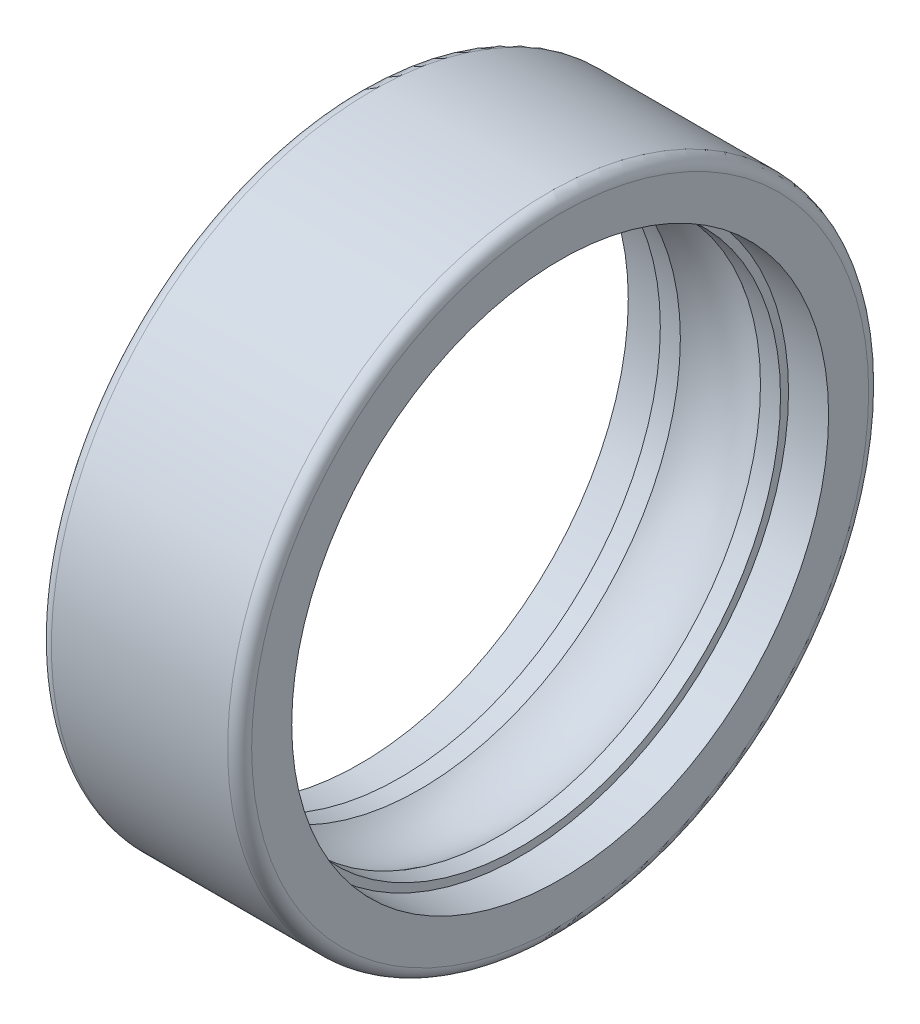
ISO-10303-21;
HEADER;
FILE_DESCRIPTION(('STEP AP214'),'2;1');
FILE_NAME('part.step','',(''),(''),'','','');
FILE_SCHEMA(('AUTOMOTIVE_DESIGN { 1 0 10303 214 1 1 1 1 }'));
ENDSEC;
DATA;
#1=APPLICATION_CONTEXT('core data for automotive mechanical design processes');
#2=APPLICATION_PROTOCOL_DEFINITION('international standard','automotive_design',2000,#1);
#3=PRODUCT_CONTEXT('',#1,'mechanical');
#4=PRODUCT('Part','Part','',(#3));
#5=PRODUCT_RELATED_PRODUCT_CATEGORY('part','',(#4));
#6=PRODUCT_DEFINITION_FORMATION('','',#4);
#7=PRODUCT_DEFINITION_CONTEXT('part definition',#1,'design');
#8=PRODUCT_DEFINITION('design','',#6,#7);
#9=PRODUCT_DEFINITION_SHAPE('','',#8);
#10=(LENGTH_UNIT() NAMED_UNIT(*) SI_UNIT(.MILLI.,.METRE.));
#11=(NAMED_UNIT(*) PLANE_ANGLE_UNIT() SI_UNIT($,.RADIAN.));
#12=(NAMED_UNIT(*) SI_UNIT($,.STERADIAN.) SOLID_ANGLE_UNIT());
#13=UNCERTAINTY_MEASURE_WITH_UNIT(LENGTH_MEASURE(1.E-05),#10,'distance_accuracy_value','');
#14=(GEOMETRIC_REPRESENTATION_CONTEXT(3) GLOBAL_UNCERTAINTY_ASSIGNED_CONTEXT((#13)) GLOBAL_UNIT_ASSIGNED_CONTEXT((#10,
#11,#12)) REPRESENTATION_CONTEXT('',''));
#15=CARTESIAN_POINT('',(0.,0.,0.));
#16=DIRECTION('',(0.,0.,1.));
#17=DIRECTION('',(1.,0.,0.));
#18=AXIS2_PLACEMENT_3D('',#15,#16,#17);
#19=CARTESIAN_POINT('',(-2.5,0.,6.7));
#20=DIRECTION('',(-1.,0.,0.));
#21=DIRECTION('',(0.,0.,1.));
#22=AXIS2_PLACEMENT_3D('',#19,#20,#21);
#23=PLANE('',#22);
#24=CARTESIAN_POINT('',(-2.5,0.,0.));
#25=DIRECTION('',(-1.,0.,0.));
#26=DIRECTION('',(0.,0.,1.));
#27=AXIS2_PLACEMENT_3D('',#24,#25,#26);
#28=CIRCLE('',#27,6.7);
#29=CARTESIAN_POINT('',(-2.5,0.,-6.7));
#30=VERTEX_POINT('',#29);
#31=EDGE_CURVE('E175',#30,#30,#28,.T.);
#32=ORIENTED_EDGE('',*,*,#31,.F.);
#33=EDGE_LOOP('',(#32));
#34=FACE_BOUND('',#33,.T.);
#35=CARTESIAN_POINT('',(-2.5,0.,0.));
#36=DIRECTION('',(-1.,0.,0.));
#37=DIRECTION('',(0.,0.,1.));
#38=AXIS2_PLACEMENT_3D('',#35,#36,#37);
#39=CIRCLE('',#38,7.7);
#40=CARTESIAN_POINT('',(-2.5,0.,-7.7));
#41=VERTEX_POINT('',#40);
#42=EDGE_CURVE('E24',#41,#41,#39,.T.);
#43=ORIENTED_EDGE('',*,*,#42,.T.);
#44=EDGE_LOOP('',(#43));
#45=FACE_BOUND('',#44,.T.);
#46=ADVANCED_FACE('F16',(#34,#45),#23,.T.);
#47=CARTESIAN_POINT('',(-2.2,0.,0.));
#48=DIRECTION('',(-1.,0.,0.));
#49=DIRECTION('',(0.,0.,1.));
#50=AXIS2_PLACEMENT_3D('',#47,#48,#49);
#51=TOROIDAL_SURFACE('',#50,7.7,0.3);
#52=ORIENTED_EDGE('',*,*,#42,.F.);
#53=CARTESIAN_POINT('',(-2.2,0.,-7.7));
#54=DIRECTION('',(0.,-1.,0.));
#55=DIRECTION('',(0.,0.,-1.));
#56=AXIS2_PLACEMENT_3D('',#53,#54,#55);
#57=CIRCLE('',#56,0.3);
#58=CARTESIAN_POINT('',(-2.2,0.,-8.));
#59=VERTEX_POINT('',#58);
#60=EDGE_CURVE('E11',#41,#59,#57,.T.);
#61=ORIENTED_EDGE('',*,*,#60,.T.);
#62=CARTESIAN_POINT('',(-2.2,0.,0.));
#63=DIRECTION('',(-1.,0.,0.));
#64=DIRECTION('',(0.,0.,1.));
#65=AXIS2_PLACEMENT_3D('',#62,#63,#64);
#66=CIRCLE('',#65,8.);
#67=EDGE_CURVE('E66',#59,#59,#66,.T.);
#68=ORIENTED_EDGE('',*,*,#67,.T.);
#69=ORIENTED_EDGE('',*,*,#60,.F.);
#70=EDGE_LOOP('',(#52,#61,#68,#69));
#71=FACE_BOUND('',#70,.T.);
#72=ADVANCED_FACE('F103',(#71),#51,.T.);
#73=CARTESIAN_POINT('',(0.,0.,0.));
#74=DIRECTION('',(-1.,0.,0.));
#75=DIRECTION('',(0.,0.,1.));
#76=AXIS2_PLACEMENT_3D('',#73,#74,#75);
#77=CYLINDRICAL_SURFACE('',#76,8.);
#78=ORIENTED_EDGE('',*,*,#67,.F.);
#79=DIRECTION('',(1.,0.,0.));
#80=VECTOR('',#79,1.);
#81=CARTESIAN_POINT('',(0.,0.,-8.));
#82=LINE('',#81,#80);
#83=CARTESIAN_POINT('',(2.2,0.,-8.));
#84=VERTEX_POINT('',#83);
#85=EDGE_CURVE('E73',#59,#84,#82,.T.);
#86=ORIENTED_EDGE('',*,*,#85,.T.);
#87=CARTESIAN_POINT('',(2.2,0.,0.));
#88=DIRECTION('',(-1.,0.,0.));
#89=DIRECTION('',(0.,0.,1.));
#90=AXIS2_PLACEMENT_3D('',#87,#88,#89);
#91=CIRCLE('',#90,8.);
#92=EDGE_CURVE('E64',#84,#84,#91,.T.);
#93=ORIENTED_EDGE('',*,*,#92,.T.);
#94=ORIENTED_EDGE('',*,*,#85,.F.);
#95=EDGE_LOOP('',(#78,#86,#93,#94));
#96=FACE_BOUND('',#95,.T.);
#97=ADVANCED_FACE('F105',(#96),#77,.T.);
#98=CARTESIAN_POINT('',(2.2,0.,0.));
#99=DIRECTION('',(-1.,0.,0.));
#100=DIRECTION('',(0.,0.,1.));
#101=AXIS2_PLACEMENT_3D('',#98,#99,#100);
#102=TOROIDAL_SURFACE('',#101,7.7,0.3);
#103=ORIENTED_EDGE('',*,*,#92,.F.);
#104=CARTESIAN_POINT('',(2.2,0.,-7.7));
#105=DIRECTION('',(0.,-1.,0.));
#106=DIRECTION('',(0.,0.,-1.));
#107=AXIS2_PLACEMENT_3D('',#104,#105,#106);
#108=CIRCLE('',#107,0.3);
#109=CARTESIAN_POINT('',(2.5,0.,-7.7));
#110=VERTEX_POINT('',#109);
#111=EDGE_CURVE('E59',#84,#110,#108,.T.);
#112=ORIENTED_EDGE('',*,*,#111,.T.);
#113=CARTESIAN_POINT('',(2.5,0.,0.));
#114=DIRECTION('',(-1.,0.,0.));
#115=DIRECTION('',(0.,0.,1.));
#116=AXIS2_PLACEMENT_3D('',#113,#114,#115);
#117=CIRCLE('',#116,7.7);
#118=EDGE_CURVE('E62',#110,#110,#117,.T.);
#119=ORIENTED_EDGE('',*,*,#118,.T.);
#120=ORIENTED_EDGE('',*,*,#111,.F.);
#121=EDGE_LOOP('',(#103,#112,#119,#120));
#122=FACE_BOUND('',#121,.T.);
#123=ADVANCED_FACE('F60',(#122),#102,.T.);
#124=CARTESIAN_POINT('',(2.5,0.,7.7));
#125=DIRECTION('',(1.,0.,0.));
#126=DIRECTION('',(0.,1.,0.));
#127=AXIS2_PLACEMENT_3D('',#124,#125,#126);
#128=PLANE('',#127);
#129=CARTESIAN_POINT('',(2.5,0.,0.));
#130=DIRECTION('',(-1.,0.,0.));
#131=DIRECTION('',(0.,0.,1.));
#132=AXIS2_PLACEMENT_3D('',#129,#130,#131);
#133=CIRCLE('',#132,6.7);
#134=CARTESIAN_POINT('',(2.5,0.,-6.7));
#135=VERTEX_POINT('',#134);
#136=EDGE_CURVE('E96',#135,#135,#133,.T.);
#137=ORIENTED_EDGE('',*,*,#136,.T.);
#138=EDGE_LOOP('',(#137));
#139=FACE_BOUND('',#138,.T.);
#140=ORIENTED_EDGE('',*,*,#118,.F.);
#141=EDGE_LOOP('',(#140));
#142=FACE_BOUND('',#141,.T.);
#143=ADVANCED_FACE('F116',(#139,#142),#128,.T.);
#144=CARTESIAN_POINT('',(2.,0.,0.));
#145=DIRECTION('',(-1.,0.,0.));
#146=DIRECTION('',(0.,0.,1.));
#147=AXIS2_PLACEMENT_3D('',#144,#145,#146);
#148=CYLINDRICAL_SURFACE('',#147,6.7);
#149=CARTESIAN_POINT('',(1.5,0.,0.));
#150=DIRECTION('',(-1.,0.,0.));
#151=DIRECTION('',(0.,0.,1.));
#152=AXIS2_PLACEMENT_3D('',#149,#150,#151);
#153=CIRCLE('',#152,6.7);
#154=CARTESIAN_POINT('',(1.5,0.,-6.7));
#155=VERTEX_POINT('',#154);
#156=EDGE_CURVE('E89',#155,#155,#153,.T.);
#157=ORIENTED_EDGE('',*,*,#156,.T.);
#158=DIRECTION('',(1.,0.,0.));
#159=VECTOR('',#158,1.);
#160=CARTESIAN_POINT('',(2.,0.,-6.7));
#161=LINE('',#160,#159);
#162=EDGE_CURVE('E93',#155,#135,#161,.T.);
#163=ORIENTED_EDGE('',*,*,#162,.T.);
#164=ORIENTED_EDGE('',*,*,#136,.F.);
#165=ORIENTED_EDGE('',*,*,#162,.F.);
#166=EDGE_LOOP('',(#157,#163,#164,#165));
#167=FACE_BOUND('',#166,.T.);
#168=ADVANCED_FACE('F119',(#167),#148,.F.);
#169=CARTESIAN_POINT('',(1.5,0.,6.7));
#170=DIRECTION('',(1.,0.,0.));
#171=DIRECTION('',(0.,1.,0.));
#172=AXIS2_PLACEMENT_3D('',#169,#170,#171);
#173=PLANE('',#172);
#174=CARTESIAN_POINT('',(1.5,0.,0.));
#175=DIRECTION('',(-1.,0.,0.));
#176=DIRECTION('',(0.,0.,1.));
#177=AXIS2_PLACEMENT_3D('',#174,#175,#176);
#178=CIRCLE('',#177,6.5);
#179=CARTESIAN_POINT('',(1.5,0.,-6.5));
#180=VERTEX_POINT('',#179);
#181=EDGE_CURVE('E88',#180,#180,#178,.T.);
#182=ORIENTED_EDGE('',*,*,#181,.T.);
#183=EDGE_LOOP('',(#182));
#184=FACE_BOUND('',#183,.T.);
#185=ORIENTED_EDGE('',*,*,#156,.F.);
#186=EDGE_LOOP('',(#185));
#187=FACE_BOUND('',#186,.T.);
#188=ADVANCED_FACE('F123',(#184,#187),#173,.T.);
#189=CARTESIAN_POINT('',(1.25,0.,0.));
#190=DIRECTION('',(-1.,0.,0.));
#191=DIRECTION('',(0.,0.,1.));
#192=AXIS2_PLACEMENT_3D('',#189,#190,#191);
#193=CYLINDRICAL_SURFACE('',#192,6.5);
#194=CARTESIAN_POINT('',(1.,0.,0.));
#195=DIRECTION('',(-1.,0.,0.));
#196=DIRECTION('',(0.,0.,1.));
#197=AXIS2_PLACEMENT_3D('',#194,#195,#196);
#198=CIRCLE('',#197,6.5);
#199=CARTESIAN_POINT('',(1.,0.,-6.5));
#200=VERTEX_POINT('',#199);
#201=EDGE_CURVE('E80',#200,#200,#198,.T.);
#202=ORIENTED_EDGE('',*,*,#201,.T.);
#203=DIRECTION('',(1.,0.,0.));
#204=VECTOR('',#203,1.);
#205=CARTESIAN_POINT('',(1.25,0.,-6.5));
#206=LINE('',#205,#204);
#207=EDGE_CURVE('E84',#200,#180,#206,.T.);
#208=ORIENTED_EDGE('',*,*,#207,.T.);
#209=ORIENTED_EDGE('',*,*,#181,.F.);
#210=ORIENTED_EDGE('',*,*,#207,.F.);
#211=EDGE_LOOP('',(#202,#208,#209,#210));
#212=FACE_BOUND('',#211,.T.);
#213=ADVANCED_FACE('F127',(#212),#193,.F.);
#214=CARTESIAN_POINT('',(0.,0.,0.));
#215=DIRECTION('',(-1.,0.,0.));
#216=DIRECTION('',(0.,0.,1.));
#217=AXIS2_PLACEMENT_3D('',#214,#215,#216);
#218=TOROIDAL_SURFACE('',#217,4.9833333333333,1.81666666666669);
#219=CARTESIAN_POINT('',(-1.,0.,0.));
#220=DIRECTION('',(-1.,0.,0.));
#221=DIRECTION('',(0.,0.,1.));
#222=AXIS2_PLACEMENT_3D('',#219,#220,#221);
#223=CIRCLE('',#222,6.5);
#224=CARTESIAN_POINT('',(-1.,0.,-6.5));
#225=VERTEX_POINT('',#224);
#226=EDGE_CURVE('E181',#225,#225,#223,.T.);
#227=ORIENTED_EDGE('',*,*,#226,.T.);
#228=CARTESIAN_POINT('',(0.,0.,-4.9833333333333));
#229=DIRECTION('',(0.,-1.,0.));
#230=DIRECTION('',(0.,0.,-1.));
#231=AXIS2_PLACEMENT_3D('',#228,#229,#230);
#232=CIRCLE('',#231,1.81666666666669);
#233=EDGE_CURVE('E78',#225,#200,#232,.T.);
#234=ORIENTED_EDGE('',*,*,#233,.T.);
#235=ORIENTED_EDGE('',*,*,#201,.F.);
#236=ORIENTED_EDGE('',*,*,#233,.F.);
#237=EDGE_LOOP('',(#227,#234,#235,#236));
#238=FACE_BOUND('',#237,.T.);
#239=ADVANCED_FACE('F131',(#238),#218,.F.);
#240=CARTESIAN_POINT('',(-1.25,0.,0.));
#241=DIRECTION('',(-1.,0.,0.));
#242=DIRECTION('',(0.,0.,1.));
#243=AXIS2_PLACEMENT_3D('',#240,#241,#242);
#244=CYLINDRICAL_SURFACE('',#243,6.5);
#245=CARTESIAN_POINT('',(-1.5,0.,0.));
#246=DIRECTION('',(-1.,0.,0.));
#247=DIRECTION('',(0.,0.,1.));
#248=AXIS2_PLACEMENT_3D('',#245,#246,#247);
#249=CIRCLE('',#248,6.5);
#250=CARTESIAN_POINT('',(-1.5,0.,-6.5));
#251=VERTEX_POINT('',#250);
#252=EDGE_CURVE('E156',#251,#251,#249,.T.);
#253=ORIENTED_EDGE('',*,*,#252,.T.);
#254=DIRECTION('',(1.,0.,0.));
#255=VECTOR('',#254,1.);
#256=CARTESIAN_POINT('',(-1.25,0.,-6.5));
#257=LINE('',#256,#255);
#258=EDGE_CURVE('E173',#251,#225,#257,.T.);
#259=ORIENTED_EDGE('',*,*,#258,.T.);
#260=ORIENTED_EDGE('',*,*,#226,.F.);
#261=ORIENTED_EDGE('',*,*,#258,.F.);
#262=EDGE_LOOP('',(#253,#259,#260,#261));
#263=FACE_BOUND('',#262,.T.);
#264=ADVANCED_FACE('F137',(#263),#244,.F.);
#265=CARTESIAN_POINT('',(-1.5,0.,6.5));
#266=DIRECTION('',(-1.,0.,0.));
#267=DIRECTION('',(0.,0.,1.));
#268=AXIS2_PLACEMENT_3D('',#265,#266,#267);
#269=PLANE('',#268);
#270=ORIENTED_EDGE('',*,*,#252,.F.);
#271=EDGE_LOOP('',(#270));
#272=FACE_BOUND('',#271,.T.);
#273=CARTESIAN_POINT('',(-1.5,0.,0.));
#274=DIRECTION('',(-1.,0.,0.));
#275=DIRECTION('',(0.,0.,1.));
#276=AXIS2_PLACEMENT_3D('',#273,#274,#275);
#277=CIRCLE('',#276,6.7);
#278=CARTESIAN_POINT('',(-1.5,0.,-6.7));
#279=VERTEX_POINT('',#278);
#280=EDGE_CURVE('E160',#279,#279,#277,.T.);
#281=ORIENTED_EDGE('',*,*,#280,.T.);
#282=EDGE_LOOP('',(#281));
#283=FACE_BOUND('',#282,.T.);
#284=ADVANCED_FACE('F141',(#272,#283),#269,.T.);
#285=CARTESIAN_POINT('',(-2.,0.,0.));
#286=DIRECTION('',(-1.,0.,0.));
#287=DIRECTION('',(0.,0.,1.));
#288=AXIS2_PLACEMENT_3D('',#285,#286,#287);
#289=CYLINDRICAL_SURFACE('',#288,6.7);
#290=ORIENTED_EDGE('',*,*,#31,.T.);
#291=DIRECTION('',(1.,0.,0.));
#292=VECTOR('',#291,1.);
#293=CARTESIAN_POINT('',(-2.,0.,-6.7));
#294=LINE('',#293,#292);
#295=EDGE_CURVE('E167',#30,#279,#294,.T.);
#296=ORIENTED_EDGE('',*,*,#295,.T.);
#297=ORIENTED_EDGE('',*,*,#280,.F.);
#298=ORIENTED_EDGE('',*,*,#295,.F.);
#299=EDGE_LOOP('',(#290,#296,#297,#298));
#300=FACE_BOUND('',#299,.T.);
#301=ADVANCED_FACE('F143',(#300),#289,.F.);
#302=CLOSED_SHELL('',(#46,#72,#97,#123,#143,#168,#188,#213,#239,#264,#284,#301));
#303=MANIFOLD_SOLID_BREP('B1',#302);
#304=ADVANCED_BREP_SHAPE_REPRESENTATION('',(#18,#303),#14);
#305=SHAPE_DEFINITION_REPRESENTATION(#9,#304);
ENDSEC;
END-ISO-10303-21;
